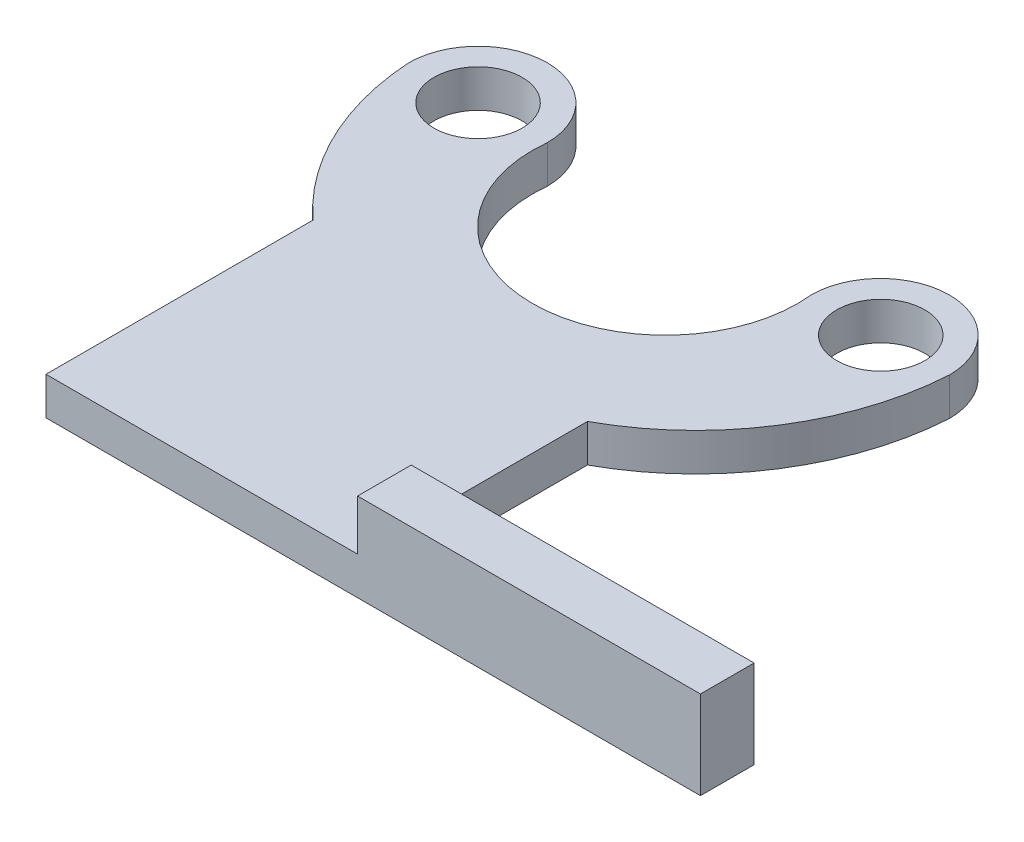
ISO-10303-21;
HEADER;
FILE_DESCRIPTION(('STEP AP214'),'2;1');
FILE_NAME('part.step','',(''),(''),'','','');
FILE_SCHEMA(('AUTOMOTIVE_DESIGN { 1 0 10303 214 1 1 1 1 }'));
ENDSEC;
DATA;
#1=APPLICATION_CONTEXT('core data for automotive mechanical design processes');
#2=APPLICATION_PROTOCOL_DEFINITION('international standard','automotive_design',2000,#1);
#3=PRODUCT_CONTEXT('',#1,'mechanical');
#4=PRODUCT('Part','Part','',(#3));
#5=PRODUCT_RELATED_PRODUCT_CATEGORY('part','',(#4));
#6=PRODUCT_DEFINITION_FORMATION('','',#4);
#7=PRODUCT_DEFINITION_CONTEXT('part definition',#1,'design');
#8=PRODUCT_DEFINITION('design','',#6,#7);
#9=PRODUCT_DEFINITION_SHAPE('','',#8);
#10=(LENGTH_UNIT() NAMED_UNIT(*) SI_UNIT(.MILLI.,.METRE.));
#11=(NAMED_UNIT(*) PLANE_ANGLE_UNIT() SI_UNIT($,.RADIAN.));
#12=(NAMED_UNIT(*) SI_UNIT($,.STERADIAN.) SOLID_ANGLE_UNIT());
#13=UNCERTAINTY_MEASURE_WITH_UNIT(LENGTH_MEASURE(1.E-05),#10,'distance_accuracy_value','');
#14=(GEOMETRIC_REPRESENTATION_CONTEXT(3) GLOBAL_UNCERTAINTY_ASSIGNED_CONTEXT((#13)) GLOBAL_UNIT_ASSIGNED_CONTEXT((#10,
#11,#12)) REPRESENTATION_CONTEXT('',''));
#15=CARTESIAN_POINT('',(0.,0.,0.));
#16=DIRECTION('',(0.,0.,1.));
#17=DIRECTION('',(1.,0.,0.));
#18=AXIS2_PLACEMENT_3D('',#15,#16,#17);
#19=CARTESIAN_POINT('',(-0.00974471247959803,1.5,0.557573359080302));
#20=DIRECTION('',(0.,1.,0.));
#21=DIRECTION('',(0.,0.,1.));
#22=AXIS2_PLACEMENT_3D('',#19,#20,#21);
#23=PLANE('',#22);
#24=DIRECTION('',(0.,0.,1.));
#25=VECTOR('',#24,1.);
#26=CARTESIAN_POINT('',(5.13878703281565,1.5,15.7927993639687));
#27=LINE('',#26,#25);
#28=CARTESIAN_POINT('',(5.13878703281565,1.5,15.7927993639687));
#29=VERTEX_POINT('',#28);
#30=CARTESIAN_POINT('',(5.13878703281565,1.5,17.9247339354452));
#31=VERTEX_POINT('',#30);
#32=EDGE_CURVE('E128',#29,#31,#27,.T.);
#33=ORIENTED_EDGE('',*,*,#32,.F.);
#34=DIRECTION('',(0.,0.,-1.));
#35=VECTOR('',#34,1.);
#36=CARTESIAN_POINT('',(5.13878703281565,1.5,15.7927993639687));
#37=LINE('',#36,#35);
#38=CARTESIAN_POINT('',(5.13878703281565,1.5,8.79279936396866));
#39=VERTEX_POINT('',#38);
#40=EDGE_CURVE('E121',#29,#39,#37,.T.);
#41=ORIENTED_EDGE('',*,*,#40,.T.);
#42=CARTESIAN_POINT('',(-0.00974471247960191,1.5,-0.655785681920986));
#43=DIRECTION('',(0.,1.,0.));
#44=DIRECTION('',(0.,0.,-1.));
#45=AXIS2_PLACEMENT_3D('',#42,#43,#44);
#46=CIRCLE('',#45,10.7602573622438);
#47=CARTESIAN_POINT('',(10.7305105750408,1.5,0.));
#48=VERTEX_POINT('',#47);
#49=EDGE_CURVE('E125',#39,#48,#46,.T.);
#50=ORIENTED_EDGE('',*,*,#49,.T.);
#51=CARTESIAN_POINT('',(7.9805105750408,1.5,0.));
#52=DIRECTION('',(0.,1.,0.));
#53=DIRECTION('',(0.,0.,1.));
#54=AXIS2_PLACEMENT_3D('',#51,#52,#53);
#55=CIRCLE('',#54,2.75);
#56=CARTESIAN_POINT('',(5.2305105750408,1.5,0.));
#57=VERTEX_POINT('',#56);
#58=EDGE_CURVE('E55',#48,#57,#55,.T.);
#59=ORIENTED_EDGE('',*,*,#58,.T.);
#60=CARTESIAN_POINT('',(-0.00974471247959803,1.5,0.557573359080302));
#61=DIRECTION('',(0.,-1.,0.));
#62=DIRECTION('',(0.,0.,1.));
#63=AXIS2_PLACEMENT_3D('',#60,#61,#62);
#64=CIRCLE('',#63,5.26983524686888);
#65=CARTESIAN_POINT('',(-5.25,1.5,0.));
#66=VERTEX_POINT('',#65);
#67=EDGE_CURVE('E167',#57,#66,#64,.T.);
#68=ORIENTED_EDGE('',*,*,#67,.T.);
#69=CARTESIAN_POINT('',(-8.,1.5,0.));
#70=DIRECTION('',(0.,1.,0.));
#71=DIRECTION('',(0.,0.,1.));
#72=AXIS2_PLACEMENT_3D('',#69,#70,#71);
#73=CIRCLE('',#72,2.75);
#74=CARTESIAN_POINT('',(-10.75,1.5,0.));
#75=VERTEX_POINT('',#74);
#76=EDGE_CURVE('E105',#66,#75,#73,.T.);
#77=ORIENTED_EDGE('',*,*,#76,.T.);
#78=CARTESIAN_POINT('',(-0.00974471247960191,1.5,-0.655785681920986));
#79=DIRECTION('',(0.,1.,0.));
#80=DIRECTION('',(0.,0.,-1.));
#81=AXIS2_PLACEMENT_3D('',#78,#79,#80);
#82=CIRCLE('',#81,10.7602573622438);
#83=CARTESIAN_POINT('',(-7.23910045960442,1.5,7.31412987492376));
#84=VERTEX_POINT('',#83);
#85=EDGE_CURVE('E188',#75,#84,#82,.T.);
#86=ORIENTED_EDGE('',*,*,#85,.T.);
#87=DIRECTION('',(0.,0.,1.));
#88=VECTOR('',#87,1.);
#89=CARTESIAN_POINT('',(-7.23910045960442,1.5,7.31412987492375));
#90=LINE('',#89,#88);
#91=CARTESIAN_POINT('',(-7.23910045960443,1.5,17.9247339354452));
#92=VERTEX_POINT('',#91);
#93=EDGE_CURVE('E208',#84,#92,#90,.T.);
#94=ORIENTED_EDGE('',*,*,#93,.T.);
#95=DIRECTION('',(1.,0.,0.));
#96=VECTOR('',#95,1.);
#97=CARTESIAN_POINT('',(-7.23910045960443,1.5,17.9247339354452));
#98=LINE('',#97,#96);
#99=EDGE_CURVE('E133',#92,#31,#98,.T.);
#100=ORIENTED_EDGE('',*,*,#99,.T.);
#101=EDGE_LOOP('',(#33,#41,#50,#59,#68,#77,#86,#94,#100));
#102=FACE_BOUND('',#101,.T.);
#103=CARTESIAN_POINT('',(-8.,1.5,0.));
#104=DIRECTION('',(0.,1.,0.));
#105=DIRECTION('',(0.,0.,1.));
#106=AXIS2_PLACEMENT_3D('',#103,#104,#105);
#107=CIRCLE('',#106,1.75);
#108=CARTESIAN_POINT('',(-8.,1.5,1.75));
#109=VERTEX_POINT('',#108);
#110=EDGE_CURVE('E152',#109,#109,#107,.T.);
#111=ORIENTED_EDGE('',*,*,#110,.F.);
#112=EDGE_LOOP('',(#111));
#113=FACE_BOUND('',#112,.T.);
#114=CARTESIAN_POINT('',(8.,1.5,0.));
#115=DIRECTION('',(0.,1.,0.));
#116=DIRECTION('',(0.,0.,1.));
#117=AXIS2_PLACEMENT_3D('',#114,#115,#116);
#118=CIRCLE('',#117,1.75);
#119=CARTESIAN_POINT('',(8.,1.5,1.75000000000006));
#120=VERTEX_POINT('',#119);
#121=EDGE_CURVE('E217',#120,#120,#118,.T.);
#122=ORIENTED_EDGE('',*,*,#121,.F.);
#123=EDGE_LOOP('',(#122));
#124=FACE_BOUND('',#123,.T.);
#125=ADVANCED_FACE('F38',(#102,#113,#124),#23,.T.);
#126=CARTESIAN_POINT('',(-0.00974471247959803,0.,0.557573359080302));
#127=DIRECTION('',(0.,1.,0.));
#128=DIRECTION('',(0.,0.,1.));
#129=AXIS2_PLACEMENT_3D('',#126,#127,#128);
#130=PLANE('',#129);
#131=CARTESIAN_POINT('',(-0.00974471247959803,0.,0.557573359080302));
#132=DIRECTION('',(0.,-1.,0.));
#133=DIRECTION('',(0.,0.,1.));
#134=AXIS2_PLACEMENT_3D('',#131,#132,#133);
#135=CIRCLE('',#134,5.26983524686888);
#136=CARTESIAN_POINT('',(5.2305105750408,0.,0.));
#137=VERTEX_POINT('',#136);
#138=CARTESIAN_POINT('',(-5.25,0.,0.));
#139=VERTEX_POINT('',#138);
#140=EDGE_CURVE('E148',#137,#139,#135,.T.);
#141=ORIENTED_EDGE('',*,*,#140,.F.);
#142=CARTESIAN_POINT('',(7.9805105750408,0.,0.));
#143=DIRECTION('',(0.,1.,0.));
#144=DIRECTION('',(0.,0.,1.));
#145=AXIS2_PLACEMENT_3D('',#142,#143,#144);
#146=CIRCLE('',#145,2.75);
#147=CARTESIAN_POINT('',(10.7305105750408,0.,0.));
#148=VERTEX_POINT('',#147);
#149=EDGE_CURVE('E97',#148,#137,#146,.T.);
#150=ORIENTED_EDGE('',*,*,#149,.F.);
#151=CARTESIAN_POINT('',(-0.00974471247960191,0.,-0.655785681920986));
#152=DIRECTION('',(0.,1.,0.));
#153=DIRECTION('',(0.,0.,-1.));
#154=AXIS2_PLACEMENT_3D('',#151,#152,#153);
#155=CIRCLE('',#154,10.7602573622438);
#156=CARTESIAN_POINT('',(5.13878703281565,0.,8.79279936396866));
#157=VERTEX_POINT('',#156);
#158=EDGE_CURVE('E91',#157,#148,#155,.T.);
#159=ORIENTED_EDGE('',*,*,#158,.F.);
#160=DIRECTION('',(0.,0.,-1.));
#161=VECTOR('',#160,1.);
#162=CARTESIAN_POINT('',(5.13878703281565,0.,15.7927993639687));
#163=LINE('',#162,#161);
#164=CARTESIAN_POINT('',(5.13878703281565,0.,15.7927993639687));
#165=VERTEX_POINT('',#164);
#166=EDGE_CURVE('E138',#165,#157,#163,.T.);
#167=ORIENTED_EDGE('',*,*,#166,.F.);
#168=DIRECTION('',(-1.,0.,0.));
#169=VECTOR('',#168,1.);
#170=CARTESIAN_POINT('',(18.7608995403956,0.,15.7927993639687));
#171=LINE('',#170,#169);
#172=CARTESIAN_POINT('',(18.7608995403956,0.,15.7927993639687));
#173=VERTEX_POINT('',#172);
#174=EDGE_CURVE('E162',#173,#165,#171,.T.);
#175=ORIENTED_EDGE('',*,*,#174,.F.);
#176=DIRECTION('',(0.,0.,-1.));
#177=VECTOR('',#176,1.);
#178=CARTESIAN_POINT('',(18.7608995403956,0.,15.7927993639687));
#179=LINE('',#178,#177);
#180=CARTESIAN_POINT('',(18.7608995403956,0.,17.9247339354452));
#181=VERTEX_POINT('',#180);
#182=EDGE_CURVE('E160',#181,#173,#179,.T.);
#183=ORIENTED_EDGE('',*,*,#182,.F.);
#184=DIRECTION('',(1.,0.,0.));
#185=VECTOR('',#184,1.);
#186=CARTESIAN_POINT('',(-7.23910045960443,0.,17.9247339354452));
#187=LINE('',#186,#185);
#188=CARTESIAN_POINT('',(-7.23910045960443,0.,17.9247339354452));
#189=VERTEX_POINT('',#188);
#190=EDGE_CURVE('E158',#189,#181,#187,.T.);
#191=ORIENTED_EDGE('',*,*,#190,.F.);
#192=DIRECTION('',(0.,0.,1.));
#193=VECTOR('',#192,1.);
#194=CARTESIAN_POINT('',(-7.23910045960442,0.,7.31412987492375));
#195=LINE('',#194,#193);
#196=CARTESIAN_POINT('',(-7.23910045960442,0.,7.31412987492376));
#197=VERTEX_POINT('',#196);
#198=EDGE_CURVE('E156',#197,#189,#195,.T.);
#199=ORIENTED_EDGE('',*,*,#198,.F.);
#200=CARTESIAN_POINT('',(-0.00974471247960191,0.,-0.655785681920986));
#201=DIRECTION('',(0.,1.,0.));
#202=DIRECTION('',(0.,0.,-1.));
#203=AXIS2_PLACEMENT_3D('',#200,#201,#202);
#204=CIRCLE('',#203,10.7602573622438);
#205=CARTESIAN_POINT('',(-10.75,0.,0.));
#206=VERTEX_POINT('',#205);
#207=EDGE_CURVE('E154',#206,#197,#204,.T.);
#208=ORIENTED_EDGE('',*,*,#207,.F.);
#209=CARTESIAN_POINT('',(-8.,0.,0.));
#210=DIRECTION('',(0.,1.,0.));
#211=DIRECTION('',(0.,0.,1.));
#212=AXIS2_PLACEMENT_3D('',#209,#210,#211);
#213=CIRCLE('',#212,2.75);
#214=EDGE_CURVE('E151',#139,#206,#213,.T.);
#215=ORIENTED_EDGE('',*,*,#214,.F.);
#216=EDGE_LOOP('',(#141,#150,#159,#167,#175,#183,#191,#199,#208,#215));
#217=FACE_BOUND('',#216,.T.);
#218=CARTESIAN_POINT('',(-8.,0.,0.));
#219=DIRECTION('',(0.,1.,0.));
#220=DIRECTION('',(0.,0.,1.));
#221=AXIS2_PLACEMENT_3D('',#218,#219,#220);
#222=CIRCLE('',#221,1.75);
#223=CARTESIAN_POINT('',(-8.,0.,1.75));
#224=VERTEX_POINT('',#223);
#225=EDGE_CURVE('E214',#224,#224,#222,.T.);
#226=ORIENTED_EDGE('',*,*,#225,.T.);
#227=EDGE_LOOP('',(#226));
#228=FACE_BOUND('',#227,.T.);
#229=CARTESIAN_POINT('',(8.,0.,0.));
#230=DIRECTION('',(0.,1.,0.));
#231=DIRECTION('',(0.,0.,1.));
#232=AXIS2_PLACEMENT_3D('',#229,#230,#231);
#233=CIRCLE('',#232,1.75);
#234=CARTESIAN_POINT('',(8.,0.,1.75000000000006));
#235=VERTEX_POINT('',#234);
#236=EDGE_CURVE('E220',#235,#235,#233,.T.);
#237=ORIENTED_EDGE('',*,*,#236,.T.);
#238=EDGE_LOOP('',(#237));
#239=FACE_BOUND('',#238,.T.);
#240=ADVANCED_FACE('F192',(#217,#228,#239),#130,.F.);
#241=CARTESIAN_POINT('',(-0.00974471247959803,1.5,0.557573359080302));
#242=DIRECTION('',(0.,-1.,0.));
#243=DIRECTION('',(0.,0.,-1.));
#244=AXIS2_PLACEMENT_3D('',#241,#242,#243);
#245=CYLINDRICAL_SURFACE('',#244,5.26983524686888);
#246=ORIENTED_EDGE('',*,*,#140,.T.);
#247=DIRECTION('',(0.,-1.,0.));
#248=VECTOR('',#247,1.);
#249=CARTESIAN_POINT('',(-5.25,1.5,0.));
#250=LINE('',#249,#248);
#251=EDGE_CURVE('E11',#66,#139,#250,.T.);
#252=ORIENTED_EDGE('',*,*,#251,.F.);
#253=ORIENTED_EDGE('',*,*,#67,.F.);
#254=DIRECTION('',(0.,-1.,0.));
#255=VECTOR('',#254,1.);
#256=CARTESIAN_POINT('',(5.2305105750408,1.5,0.));
#257=LINE('',#256,#255);
#258=EDGE_CURVE('E144',#57,#137,#257,.T.);
#259=ORIENTED_EDGE('',*,*,#258,.T.);
#260=EDGE_LOOP('',(#246,#252,#253,#259));
#261=FACE_BOUND('',#260,.T.);
#262=ADVANCED_FACE('F40',(#261),#245,.F.);
#263=CARTESIAN_POINT('',(-8.,1.5,0.));
#264=DIRECTION('',(0.,-1.,0.));
#265=DIRECTION('',(0.,0.,-1.));
#266=AXIS2_PLACEMENT_3D('',#263,#264,#265);
#267=CYLINDRICAL_SURFACE('',#266,2.75);
#268=ORIENTED_EDGE('',*,*,#214,.T.);
#269=DIRECTION('',(0.,-1.,0.));
#270=VECTOR('',#269,1.);
#271=CARTESIAN_POINT('',(-10.75,1.5,0.));
#272=LINE('',#271,#270);
#273=EDGE_CURVE('E47',#75,#206,#272,.T.);
#274=ORIENTED_EDGE('',*,*,#273,.F.);
#275=ORIENTED_EDGE('',*,*,#76,.F.);
#276=ORIENTED_EDGE('',*,*,#251,.T.);
#277=EDGE_LOOP('',(#268,#274,#275,#276));
#278=FACE_BOUND('',#277,.T.);
#279=ADVANCED_FACE('F338',(#278),#267,.T.);
#280=CARTESIAN_POINT('',(-0.00974471247960191,1.5,-0.655785681920986));
#281=DIRECTION('',(0.,-1.,0.));
#282=DIRECTION('',(0.,0.,-1.));
#283=AXIS2_PLACEMENT_3D('',#280,#281,#282);
#284=CYLINDRICAL_SURFACE('',#283,10.7602573622438);
#285=ORIENTED_EDGE('',*,*,#207,.T.);
#286=DIRECTION('',(0.,-1.,0.));
#287=VECTOR('',#286,1.);
#288=CARTESIAN_POINT('',(-7.23910045960442,1.5,7.31412987492376));
#289=LINE('',#288,#287);
#290=EDGE_CURVE('E180',#84,#197,#289,.T.);
#291=ORIENTED_EDGE('',*,*,#290,.F.);
#292=ORIENTED_EDGE('',*,*,#85,.F.);
#293=ORIENTED_EDGE('',*,*,#273,.T.);
#294=EDGE_LOOP('',(#285,#291,#292,#293));
#295=FACE_BOUND('',#294,.T.);
#296=ADVANCED_FACE('F186',(#295),#284,.T.);
#297=CARTESIAN_POINT('',(-7.23910045960442,1.5,7.31412987492375));
#298=DIRECTION('',(1.,0.,0.));
#299=DIRECTION('',(0.,0.,-1.));
#300=AXIS2_PLACEMENT_3D('',#297,#298,#299);
#301=PLANE('',#300);
#302=ORIENTED_EDGE('',*,*,#198,.T.);
#303=DIRECTION('',(0.,-1.,0.));
#304=VECTOR('',#303,1.);
#305=CARTESIAN_POINT('',(-7.23910045960443,1.5,17.9247339354452));
#306=LINE('',#305,#304);
#307=EDGE_CURVE('E177',#92,#189,#306,.T.);
#308=ORIENTED_EDGE('',*,*,#307,.F.);
#309=ORIENTED_EDGE('',*,*,#93,.F.);
#310=ORIENTED_EDGE('',*,*,#290,.T.);
#311=EDGE_LOOP('',(#302,#308,#309,#310));
#312=FACE_BOUND('',#311,.T.);
#313=ADVANCED_FACE('F198',(#312),#301,.F.);
#314=CARTESIAN_POINT('',(-7.23910045960443,1.5,17.9247339354452));
#315=DIRECTION('',(0.,0.,-1.));
#316=DIRECTION('',(-1.,0.,0.));
#317=AXIS2_PLACEMENT_3D('',#314,#315,#316);
#318=PLANE('',#317);
#319=ORIENTED_EDGE('',*,*,#190,.T.);
#320=DIRECTION('',(0.,-1.,0.));
#321=VECTOR('',#320,1.);
#322=CARTESIAN_POINT('',(18.7608995403956,1.5,17.9247339354452));
#323=LINE('',#322,#321);
#324=CARTESIAN_POINT('',(18.7608995403956,3.5,17.9247339354452));
#325=VERTEX_POINT('',#324);
#326=EDGE_CURVE('E174',#325,#181,#323,.T.);
#327=ORIENTED_EDGE('',*,*,#326,.F.);
#328=DIRECTION('',(1.,0.,0.));
#329=VECTOR('',#328,1.);
#330=CARTESIAN_POINT('',(5.13878703281565,3.5,17.9247339354452));
#331=LINE('',#330,#329);
#332=CARTESIAN_POINT('',(5.13878703281565,3.5,17.9247339354452));
#333=VERTEX_POINT('',#332);
#334=EDGE_CURVE('E236',#333,#325,#331,.T.);
#335=ORIENTED_EDGE('',*,*,#334,.F.);
#336=DIRECTION('',(0.,-1.,0.));
#337=VECTOR('',#336,1.);
#338=CARTESIAN_POINT('',(5.13878703281565,3.5,17.9247339354452));
#339=LINE('',#338,#337);
#340=EDGE_CURVE('E207',#333,#31,#339,.T.);
#341=ORIENTED_EDGE('',*,*,#340,.T.);
#342=ORIENTED_EDGE('',*,*,#99,.F.);
#343=ORIENTED_EDGE('',*,*,#307,.T.);
#344=EDGE_LOOP('',(#319,#327,#335,#341,#342,#343));
#345=FACE_BOUND('',#344,.T.);
#346=ADVANCED_FACE('F202',(#345),#318,.F.);
#347=CARTESIAN_POINT('',(18.7608995403956,1.5,15.7927993639687));
#348=DIRECTION('',(-1.,0.,0.));
#349=DIRECTION('',(0.,0.,1.));
#350=AXIS2_PLACEMENT_3D('',#347,#348,#349);
#351=PLANE('',#350);
#352=ORIENTED_EDGE('',*,*,#182,.T.);
#353=DIRECTION('',(0.,-1.,0.));
#354=VECTOR('',#353,1.);
#355=CARTESIAN_POINT('',(18.7608995403956,1.5,15.7927993639687));
#356=LINE('',#355,#354);
#357=CARTESIAN_POINT('',(18.7608995403956,3.5,15.7927993639687));
#358=VERTEX_POINT('',#357);
#359=EDGE_CURVE('E171',#358,#173,#356,.T.);
#360=ORIENTED_EDGE('',*,*,#359,.F.);
#361=DIRECTION('',(0.,0.,-1.));
#362=VECTOR('',#361,1.);
#363=CARTESIAN_POINT('',(18.7608995403956,3.5,15.7927993639687));
#364=LINE('',#363,#362);
#365=EDGE_CURVE('E233',#325,#358,#364,.T.);
#366=ORIENTED_EDGE('',*,*,#365,.F.);
#367=ORIENTED_EDGE('',*,*,#326,.T.);
#368=EDGE_LOOP('',(#352,#360,#366,#367));
#369=FACE_BOUND('',#368,.T.);
#370=ADVANCED_FACE('F258',(#369),#351,.F.);
#371=CARTESIAN_POINT('',(18.7608995403956,1.5,15.7927993639687));
#372=DIRECTION('',(0.,0.,1.));
#373=DIRECTION('',(1.,0.,0.));
#374=AXIS2_PLACEMENT_3D('',#371,#372,#373);
#375=PLANE('',#374);
#376=ORIENTED_EDGE('',*,*,#174,.T.);
#377=DIRECTION('',(0.,-1.,0.));
#378=VECTOR('',#377,1.);
#379=CARTESIAN_POINT('',(5.13878703281565,1.5,15.7927993639687));
#380=LINE('',#379,#378);
#381=EDGE_CURVE('E139',#29,#165,#380,.T.);
#382=ORIENTED_EDGE('',*,*,#381,.F.);
#383=DIRECTION('',(0.,-1.,0.));
#384=VECTOR('',#383,1.);
#385=CARTESIAN_POINT('',(5.13878703281565,3.5,15.7927993639687));
#386=LINE('',#385,#384);
#387=CARTESIAN_POINT('',(5.13878703281565,3.5,15.7927993639687));
#388=VERTEX_POINT('',#387);
#389=EDGE_CURVE('E226',#388,#29,#386,.T.);
#390=ORIENTED_EDGE('',*,*,#389,.F.);
#391=DIRECTION('',(-1.,0.,0.));
#392=VECTOR('',#391,1.);
#393=CARTESIAN_POINT('',(5.13878703281565,3.5,15.7927993639687));
#394=LINE('',#393,#392);
#395=EDGE_CURVE('E228',#358,#388,#394,.T.);
#396=ORIENTED_EDGE('',*,*,#395,.F.);
#397=ORIENTED_EDGE('',*,*,#359,.T.);
#398=EDGE_LOOP('',(#376,#382,#390,#396,#397));
#399=FACE_BOUND('',#398,.T.);
#400=ADVANCED_FACE('F252',(#399),#375,.F.);
#401=CARTESIAN_POINT('',(5.13878703281565,1.5,15.7927993639687));
#402=DIRECTION('',(-1.,0.,0.));
#403=DIRECTION('',(0.,0.,1.));
#404=AXIS2_PLACEMENT_3D('',#401,#402,#403);
#405=PLANE('',#404);
#406=ORIENTED_EDGE('',*,*,#166,.T.);
#407=DIRECTION('',(0.,-1.,0.));
#408=VECTOR('',#407,1.);
#409=CARTESIAN_POINT('',(5.13878703281565,1.5,8.79279936396866));
#410=LINE('',#409,#408);
#411=EDGE_CURVE('E135',#39,#157,#410,.T.);
#412=ORIENTED_EDGE('',*,*,#411,.F.);
#413=ORIENTED_EDGE('',*,*,#40,.F.);
#414=ORIENTED_EDGE('',*,*,#381,.T.);
#415=EDGE_LOOP('',(#406,#412,#413,#414));
#416=FACE_BOUND('',#415,.T.);
#417=ADVANCED_FACE('F136',(#416),#405,.F.);
#418=CARTESIAN_POINT('',(-0.00974471247960191,1.5,-0.655785681920986));
#419=DIRECTION('',(0.,-1.,0.));
#420=DIRECTION('',(0.,0.,-1.));
#421=AXIS2_PLACEMENT_3D('',#418,#419,#420);
#422=CYLINDRICAL_SURFACE('',#421,10.7602573622438);
#423=ORIENTED_EDGE('',*,*,#158,.T.);
#424=DIRECTION('',(0.,-1.,0.));
#425=VECTOR('',#424,1.);
#426=CARTESIAN_POINT('',(10.7305105750408,1.5,0.));
#427=LINE('',#426,#425);
#428=EDGE_CURVE('E140',#48,#148,#427,.T.);
#429=ORIENTED_EDGE('',*,*,#428,.F.);
#430=ORIENTED_EDGE('',*,*,#49,.F.);
#431=ORIENTED_EDGE('',*,*,#411,.T.);
#432=EDGE_LOOP('',(#423,#429,#430,#431));
#433=FACE_BOUND('',#432,.T.);
#434=ADVANCED_FACE('F142',(#433),#422,.T.);
#435=CARTESIAN_POINT('',(7.9805105750408,1.5,0.));
#436=DIRECTION('',(0.,-1.,0.));
#437=DIRECTION('',(0.,0.,-1.));
#438=AXIS2_PLACEMENT_3D('',#435,#436,#437);
#439=CYLINDRICAL_SURFACE('',#438,2.75);
#440=ORIENTED_EDGE('',*,*,#149,.T.);
#441=ORIENTED_EDGE('',*,*,#258,.F.);
#442=ORIENTED_EDGE('',*,*,#58,.F.);
#443=ORIENTED_EDGE('',*,*,#428,.T.);
#444=EDGE_LOOP('',(#440,#441,#442,#443));
#445=FACE_BOUND('',#444,.T.);
#446=ADVANCED_FACE('F263',(#445),#439,.T.);
#447=CARTESIAN_POINT('',(-8.,1.5,0.));
#448=DIRECTION('',(0.,-1.,0.));
#449=DIRECTION('',(0.,0.,-1.));
#450=AXIS2_PLACEMENT_3D('',#447,#448,#449);
#451=CYLINDRICAL_SURFACE('',#450,1.75);
#452=ORIENTED_EDGE('',*,*,#110,.T.);
#453=EDGE_LOOP('',(#452));
#454=FACE_BOUND('',#453,.T.);
#455=ORIENTED_EDGE('',*,*,#225,.F.);
#456=EDGE_LOOP('',(#455));
#457=FACE_BOUND('',#456,.T.);
#458=ADVANCED_FACE('F265',(#454,#457),#451,.F.);
#459=CARTESIAN_POINT('',(8.,1.5,0.));
#460=DIRECTION('',(0.,-1.,0.));
#461=DIRECTION('',(0.,0.,-1.));
#462=AXIS2_PLACEMENT_3D('',#459,#460,#461);
#463=CYLINDRICAL_SURFACE('',#462,1.75);
#464=ORIENTED_EDGE('',*,*,#121,.T.);
#465=EDGE_LOOP('',(#464));
#466=FACE_BOUND('',#465,.T.);
#467=ORIENTED_EDGE('',*,*,#236,.F.);
#468=EDGE_LOOP('',(#467));
#469=FACE_BOUND('',#468,.T.);
#470=ADVANCED_FACE('F271',(#466,#469),#463,.F.);
#471=CARTESIAN_POINT('',(5.13878703281565,3.5,15.7927993639687));
#472=DIRECTION('',(1.,0.,0.));
#473=DIRECTION('',(0.,0.,-1.));
#474=AXIS2_PLACEMENT_3D('',#471,#472,#473);
#475=PLANE('',#474);
#476=ORIENTED_EDGE('',*,*,#32,.T.);
#477=ORIENTED_EDGE('',*,*,#340,.F.);
#478=DIRECTION('',(0.,0.,1.));
#479=VECTOR('',#478,1.);
#480=CARTESIAN_POINT('',(5.13878703281565,3.5,15.7927993639687));
#481=LINE('',#480,#479);
#482=EDGE_CURVE('E230',#388,#333,#481,.T.);
#483=ORIENTED_EDGE('',*,*,#482,.F.);
#484=ORIENTED_EDGE('',*,*,#389,.T.);
#485=EDGE_LOOP('',(#476,#477,#483,#484));
#486=FACE_BOUND('',#485,.T.);
#487=ADVANCED_FACE('F250',(#486),#475,.F.);
#488=CARTESIAN_POINT('',(0.,3.5,0.));
#489=DIRECTION('',(0.,1.,0.));
#490=DIRECTION('',(0.,0.,1.));
#491=AXIS2_PLACEMENT_3D('',#488,#489,#490);
#492=PLANE('',#491);
#493=ORIENTED_EDGE('',*,*,#482,.T.);
#494=ORIENTED_EDGE('',*,*,#334,.T.);
#495=ORIENTED_EDGE('',*,*,#365,.T.);
#496=ORIENTED_EDGE('',*,*,#395,.T.);
#497=EDGE_LOOP('',(#493,#494,#495,#496));
#498=FACE_BOUND('',#497,.T.);
#499=ADVANCED_FACE('F243',(#498),#492,.T.);
#500=CLOSED_SHELL('',(#125,#240,#262,#279,#296,#313,#346,#370,#400,#417,#434,#446,#458,#470,
#487,#499));
#501=MANIFOLD_SOLID_BREP('B2',#500);
#502=ADVANCED_BREP_SHAPE_REPRESENTATION('',(#18,#501),#14);
#503=SHAPE_DEFINITION_REPRESENTATION(#9,#502);
ENDSEC;
END-ISO-10303-21;
